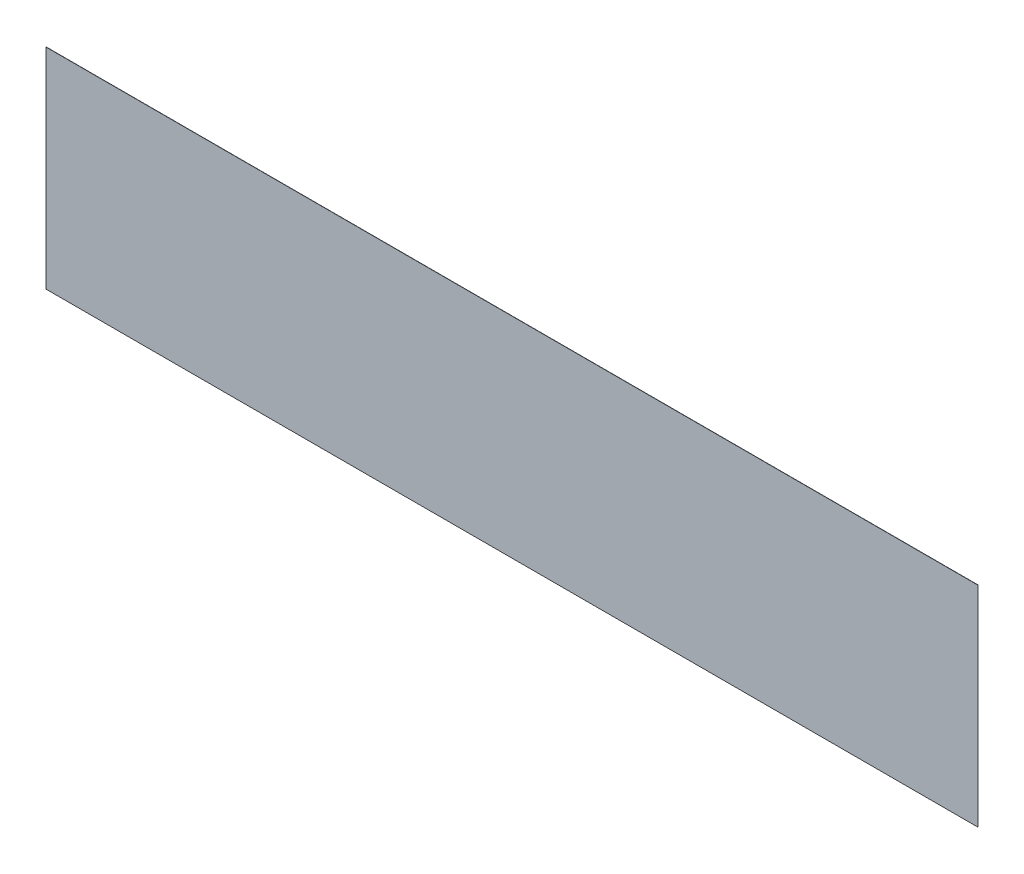
ISO-10303-21;
HEADER;
FILE_DESCRIPTION(('STEP AP214'),'2;1');
FILE_NAME('part.step','',(''),(''),'','','');
FILE_SCHEMA(('AUTOMOTIVE_DESIGN { 1 0 10303 214 1 1 1 1 }'));
ENDSEC;
DATA;
#1=APPLICATION_CONTEXT('core data for automotive mechanical design processes');
#2=APPLICATION_PROTOCOL_DEFINITION('international standard','automotive_design',2000,#1);
#3=PRODUCT_CONTEXT('',#1,'mechanical');
#4=PRODUCT('Part','Part','',(#3));
#5=PRODUCT_RELATED_PRODUCT_CATEGORY('part','',(#4));
#6=PRODUCT_DEFINITION_FORMATION('','',#4);
#7=PRODUCT_DEFINITION_CONTEXT('part definition',#1,'design');
#8=PRODUCT_DEFINITION('design','',#6,#7);
#9=PRODUCT_DEFINITION_SHAPE('','',#8);
#10=(LENGTH_UNIT() NAMED_UNIT(*) SI_UNIT(.MILLI.,.METRE.));
#11=(NAMED_UNIT(*) PLANE_ANGLE_UNIT() SI_UNIT($,.RADIAN.));
#12=(NAMED_UNIT(*) SI_UNIT($,.STERADIAN.) SOLID_ANGLE_UNIT());
#13=UNCERTAINTY_MEASURE_WITH_UNIT(LENGTH_MEASURE(1.E-05),#10,'distance_accuracy_value','');
#14=(GEOMETRIC_REPRESENTATION_CONTEXT(3) GLOBAL_UNCERTAINTY_ASSIGNED_CONTEXT((#13)) GLOBAL_UNIT_ASSIGNED_CONTEXT((#10,
#11,#12)) REPRESENTATION_CONTEXT('',''));
#15=CARTESIAN_POINT('',(0.,0.,0.));
#16=DIRECTION('',(0.,0.,1.));
#17=DIRECTION('',(1.,0.,0.));
#18=AXIS2_PLACEMENT_3D('',#15,#16,#17);
#19=CARTESIAN_POINT('',(20.,-4.5,0.01));
#20=DIRECTION('',(-1.,0.,0.));
#21=DIRECTION('',(0.,0.,1.));
#22=AXIS2_PLACEMENT_3D('',#19,#20,#21);
#23=PLANE('',#22);
#24=DIRECTION('',(0.,1.,0.));
#25=VECTOR('',#24,1.);
#26=CARTESIAN_POINT('',(20.,-4.5,0.));
#27=LINE('',#26,#25);
#28=CARTESIAN_POINT('',(20.,-4.5,0.));
#29=VERTEX_POINT('',#28);
#30=CARTESIAN_POINT('',(20.,4.5,0.));
#31=VERTEX_POINT('',#30);
#32=EDGE_CURVE('E95',#29,#31,#27,.T.);
#33=ORIENTED_EDGE('',*,*,#32,.T.);
#34=DIRECTION('',(0.,0.,-1.));
#35=VECTOR('',#34,1.);
#36=CARTESIAN_POINT('',(20.,4.5,0.01));
#37=LINE('',#36,#35);
#38=CARTESIAN_POINT('',(20.,4.5,0.01));
#39=VERTEX_POINT('',#38);
#40=EDGE_CURVE('E11',#39,#31,#37,.T.);
#41=ORIENTED_EDGE('',*,*,#40,.F.);
#42=DIRECTION('',(0.,1.,0.));
#43=VECTOR('',#42,1.);
#44=CARTESIAN_POINT('',(20.,-4.5,0.01));
#45=LINE('',#44,#43);
#46=CARTESIAN_POINT('',(20.,-4.5,0.01));
#47=VERTEX_POINT('',#46);
#48=EDGE_CURVE('E83',#47,#39,#45,.T.);
#49=ORIENTED_EDGE('',*,*,#48,.F.);
#50=DIRECTION('',(0.,0.,-1.));
#51=VECTOR('',#50,1.);
#52=CARTESIAN_POINT('',(20.,-4.5,0.01));
#53=LINE('',#52,#51);
#54=EDGE_CURVE('E91',#47,#29,#53,.T.);
#55=ORIENTED_EDGE('',*,*,#54,.T.);
#56=EDGE_LOOP('',(#33,#41,#49,#55));
#57=FACE_BOUND('',#56,.T.);
#58=ADVANCED_FACE('F32',(#57),#23,.F.);
#59=CARTESIAN_POINT('',(-20.,4.5,0.01));
#60=DIRECTION('',(0.,-1.,0.));
#61=DIRECTION('',(0.,0.,-1.));
#62=AXIS2_PLACEMENT_3D('',#59,#60,#61);
#63=PLANE('',#62);
#64=DIRECTION('',(-1.,0.,0.));
#65=VECTOR('',#64,1.);
#66=CARTESIAN_POINT('',(-20.,4.5,0.));
#67=LINE('',#66,#65);
#68=CARTESIAN_POINT('',(-20.,4.5,0.));
#69=VERTEX_POINT('',#68);
#70=EDGE_CURVE('E87',#31,#69,#67,.T.);
#71=ORIENTED_EDGE('',*,*,#70,.T.);
#72=DIRECTION('',(0.,0.,-1.));
#73=VECTOR('',#72,1.);
#74=CARTESIAN_POINT('',(-20.,4.5,0.01));
#75=LINE('',#74,#73);
#76=CARTESIAN_POINT('',(-20.,4.5,0.01));
#77=VERTEX_POINT('',#76);
#78=EDGE_CURVE('E40',#77,#69,#75,.T.);
#79=ORIENTED_EDGE('',*,*,#78,.F.);
#80=DIRECTION('',(-1.,0.,0.));
#81=VECTOR('',#80,1.);
#82=CARTESIAN_POINT('',(-20.,4.5,0.01));
#83=LINE('',#82,#81);
#84=EDGE_CURVE('E78',#39,#77,#83,.T.);
#85=ORIENTED_EDGE('',*,*,#84,.F.);
#86=ORIENTED_EDGE('',*,*,#40,.T.);
#87=EDGE_LOOP('',(#71,#79,#85,#86));
#88=FACE_BOUND('',#87,.T.);
#89=ADVANCED_FACE('F86',(#88),#63,.F.);
#90=CARTESIAN_POINT('',(-20.,-4.5,0.01));
#91=DIRECTION('',(1.,0.,0.));
#92=DIRECTION('',(0.,0.,-1.));
#93=AXIS2_PLACEMENT_3D('',#90,#91,#92);
#94=PLANE('',#93);
#95=DIRECTION('',(0.,-1.,0.));
#96=VECTOR('',#95,1.);
#97=CARTESIAN_POINT('',(-20.,-4.5,0.));
#98=LINE('',#97,#96);
#99=CARTESIAN_POINT('',(-20.,-4.5,0.));
#100=VERTEX_POINT('',#99);
#101=EDGE_CURVE('E65',#69,#100,#98,.T.);
#102=ORIENTED_EDGE('',*,*,#101,.T.);
#103=DIRECTION('',(0.,0.,-1.));
#104=VECTOR('',#103,1.);
#105=CARTESIAN_POINT('',(-20.,-4.5,0.01));
#106=LINE('',#105,#104);
#107=CARTESIAN_POINT('',(-20.,-4.5,0.01));
#108=VERTEX_POINT('',#107);
#109=EDGE_CURVE('E88',#108,#100,#106,.T.);
#110=ORIENTED_EDGE('',*,*,#109,.F.);
#111=DIRECTION('',(0.,-1.,0.));
#112=VECTOR('',#111,1.);
#113=CARTESIAN_POINT('',(-20.,-4.5,0.01));
#114=LINE('',#113,#112);
#115=EDGE_CURVE('E81',#77,#108,#114,.T.);
#116=ORIENTED_EDGE('',*,*,#115,.F.);
#117=ORIENTED_EDGE('',*,*,#78,.T.);
#118=EDGE_LOOP('',(#102,#110,#116,#117));
#119=FACE_BOUND('',#118,.T.);
#120=ADVANCED_FACE('F89',(#119),#94,.F.);
#121=CARTESIAN_POINT('',(-20.,-4.5,0.01));
#122=DIRECTION('',(0.,1.,0.));
#123=DIRECTION('',(0.,0.,1.));
#124=AXIS2_PLACEMENT_3D('',#121,#122,#123);
#125=PLANE('',#124);
#126=DIRECTION('',(1.,0.,0.));
#127=VECTOR('',#126,1.);
#128=CARTESIAN_POINT('',(-20.,-4.5,0.));
#129=LINE('',#128,#127);
#130=EDGE_CURVE('E71',#100,#29,#129,.T.);
#131=ORIENTED_EDGE('',*,*,#130,.T.);
#132=ORIENTED_EDGE('',*,*,#54,.F.);
#133=DIRECTION('',(1.,0.,0.));
#134=VECTOR('',#133,1.);
#135=CARTESIAN_POINT('',(-20.,-4.5,0.01));
#136=LINE('',#135,#134);
#137=EDGE_CURVE('E48',#108,#47,#136,.T.);
#138=ORIENTED_EDGE('',*,*,#137,.F.);
#139=ORIENTED_EDGE('',*,*,#109,.T.);
#140=EDGE_LOOP('',(#131,#132,#138,#139));
#141=FACE_BOUND('',#140,.T.);
#142=ADVANCED_FACE('F102',(#141),#125,.F.);
#143=CARTESIAN_POINT('',(0.,0.,0.01));
#144=DIRECTION('',(0.,0.,-1.));
#145=DIRECTION('',(-1.,0.,0.));
#146=AXIS2_PLACEMENT_3D('',#143,#144,#145);
#147=PLANE('',#146);
#148=ORIENTED_EDGE('',*,*,#48,.T.);
#149=ORIENTED_EDGE('',*,*,#84,.T.);
#150=ORIENTED_EDGE('',*,*,#115,.T.);
#151=ORIENTED_EDGE('',*,*,#137,.T.);
#152=EDGE_LOOP('',(#148,#149,#150,#151));
#153=FACE_BOUND('',#152,.T.);
#154=ADVANCED_FACE('F79',(#153),#147,.F.);
#155=CARTESIAN_POINT('',(0.,0.,0.));
#156=DIRECTION('',(0.,0.,-1.));
#157=DIRECTION('',(-1.,0.,0.));
#158=AXIS2_PLACEMENT_3D('',#155,#156,#157);
#159=PLANE('',#158);
#160=ORIENTED_EDGE('',*,*,#32,.F.);
#161=ORIENTED_EDGE('',*,*,#130,.F.);
#162=ORIENTED_EDGE('',*,*,#101,.F.);
#163=ORIENTED_EDGE('',*,*,#70,.F.);
#164=EDGE_LOOP('',(#160,#161,#162,#163));
#165=FACE_BOUND('',#164,.T.);
#166=ADVANCED_FACE('F105',(#165),#159,.T.);
#167=CLOSED_SHELL('',(#58,#89,#120,#142,#154,#166));
#168=MANIFOLD_SOLID_BREP('B2',#167);
#169=ADVANCED_BREP_SHAPE_REPRESENTATION('',(#18,#168),#14);
#170=SHAPE_DEFINITION_REPRESENTATION(#9,#169);
ENDSEC;
END-ISO-10303-21;
